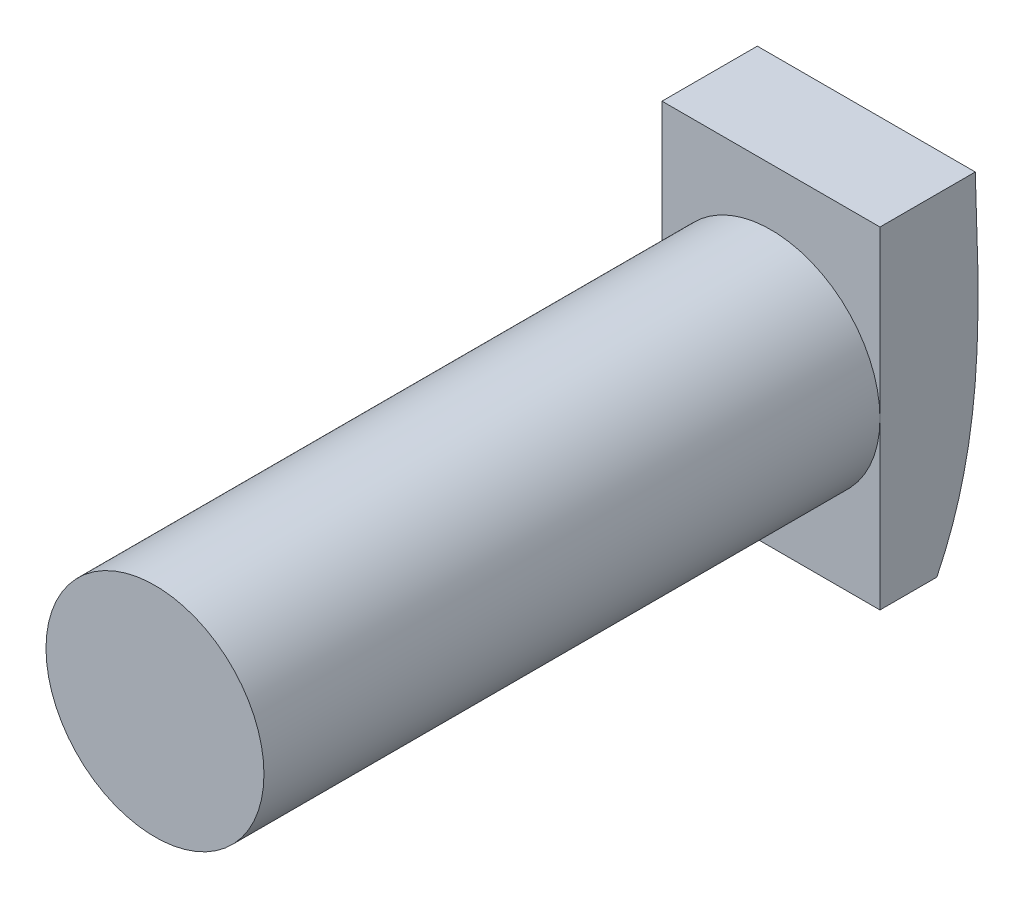
ISO-10303-21;
HEADER;
FILE_DESCRIPTION(('STEP AP214'),'2;1');
FILE_NAME('part.step','',(''),(''),'','','');
FILE_SCHEMA(('AUTOMOTIVE_DESIGN { 1 0 10303 214 1 1 1 1 }'));
ENDSEC;
DATA;
#1=APPLICATION_CONTEXT('core data for automotive mechanical design processes');
#2=APPLICATION_PROTOCOL_DEFINITION('international standard','automotive_design',2000,#1);
#3=PRODUCT_CONTEXT('',#1,'mechanical');
#4=PRODUCT('Part','Part','',(#3));
#5=PRODUCT_RELATED_PRODUCT_CATEGORY('part','',(#4));
#6=PRODUCT_DEFINITION_FORMATION('','',#4);
#7=PRODUCT_DEFINITION_CONTEXT('part definition',#1,'design');
#8=PRODUCT_DEFINITION('design','',#6,#7);
#9=PRODUCT_DEFINITION_SHAPE('','',#8);
#10=(LENGTH_UNIT() NAMED_UNIT(*) SI_UNIT(.MILLI.,.METRE.));
#11=(NAMED_UNIT(*) PLANE_ANGLE_UNIT() SI_UNIT($,.RADIAN.));
#12=(NAMED_UNIT(*) SI_UNIT($,.STERADIAN.) SOLID_ANGLE_UNIT());
#13=UNCERTAINTY_MEASURE_WITH_UNIT(LENGTH_MEASURE(1.E-05),#10,'distance_accuracy_value','');
#14=(GEOMETRIC_REPRESENTATION_CONTEXT(3) GLOBAL_UNCERTAINTY_ASSIGNED_CONTEXT((#13)) GLOBAL_UNIT_ASSIGNED_CONTEXT((#10,
#11,#12)) REPRESENTATION_CONTEXT('',''));
#15=CARTESIAN_POINT('',(0.,0.,0.));
#16=DIRECTION('',(0.,0.,1.));
#17=DIRECTION('',(1.,0.,0.));
#18=AXIS2_PLACEMENT_3D('',#15,#16,#17);
#19=CARTESIAN_POINT('',(0.,0.,13.));
#20=DIRECTION('',(0.,0.,-1.));
#21=DIRECTION('',(-1.,0.,0.));
#22=AXIS2_PLACEMENT_3D('',#19,#20,#21);
#23=CYLINDRICAL_SURFACE('',#22,2.3);
#24=CARTESIAN_POINT('',(0.,0.,13.));
#25=DIRECTION('',(0.,0.,1.));
#26=DIRECTION('',(1.,0.,0.));
#27=AXIS2_PLACEMENT_3D('',#24,#25,#26);
#28=CIRCLE('',#27,2.3);
#29=CARTESIAN_POINT('',(2.3,0.,13.));
#30=VERTEX_POINT('',#29);
#31=EDGE_CURVE('E11',#30,#30,#28,.T.);
#32=ORIENTED_EDGE('',*,*,#31,.F.);
#33=EDGE_LOOP('',(#32));
#34=FACE_BOUND('',#33,.T.);
#35=CARTESIAN_POINT('',(0.,0.,0.));
#36=DIRECTION('',(0.,0.,1.));
#37=DIRECTION('',(1.,0.,0.));
#38=AXIS2_PLACEMENT_3D('',#35,#36,#37);
#39=CIRCLE('',#38,2.3);
#40=CARTESIAN_POINT('',(2.3,0.,0.));
#41=VERTEX_POINT('',#40);
#42=CARTESIAN_POINT('',(-2.3,0.,0.));
#43=VERTEX_POINT('',#42);
#44=EDGE_CURVE('E35',#41,#43,#39,.T.);
#45=ORIENTED_EDGE('',*,*,#44,.T.);
#46=EDGE_CURVE('E107',#43,#41,#39,.T.);
#47=ORIENTED_EDGE('',*,*,#46,.T.);
#48=EDGE_LOOP('',(#45,#47));
#49=FACE_BOUND('',#48,.T.);
#50=ADVANCED_FACE('F32',(#34,#49),#23,.T.);
#51=CARTESIAN_POINT('',(0.,0.,13.));
#52=DIRECTION('',(0.,0.,1.));
#53=DIRECTION('',(1.,0.,0.));
#54=AXIS2_PLACEMENT_3D('',#51,#52,#53);
#55=PLANE('',#54);
#56=ORIENTED_EDGE('',*,*,#31,.T.);
#57=EDGE_LOOP('',(#56));
#58=FACE_BOUND('',#57,.T.);
#59=ADVANCED_FACE('F136',(#58),#55,.T.);
#60=CARTESIAN_POINT('',(0.,0.,0.));
#61=DIRECTION('',(0.,0.,1.));
#62=DIRECTION('',(1.,0.,0.));
#63=AXIS2_PLACEMENT_3D('',#60,#61,#62);
#64=PLANE('',#63);
#65=ORIENTED_EDGE('',*,*,#44,.F.);
#66=DIRECTION('',(0.,-1.,0.));
#67=VECTOR('',#66,1.);
#68=CARTESIAN_POINT('',(2.3,-3.5,0.));
#69=LINE('',#68,#67);
#70=CARTESIAN_POINT('',(2.3,3.5,0.));
#71=VERTEX_POINT('',#70);
#72=EDGE_CURVE('E54',#71,#41,#69,.T.);
#73=ORIENTED_EDGE('',*,*,#72,.F.);
#74=DIRECTION('',(1.,0.,0.));
#75=VECTOR('',#74,1.);
#76=CARTESIAN_POINT('',(2.3,3.5,0.));
#77=LINE('',#76,#75);
#78=CARTESIAN_POINT('',(-2.3,3.5,0.));
#79=VERTEX_POINT('',#78);
#80=EDGE_CURVE('E119',#79,#71,#77,.T.);
#81=ORIENTED_EDGE('',*,*,#80,.F.);
#82=DIRECTION('',(0.,1.,0.));
#83=VECTOR('',#82,1.);
#84=CARTESIAN_POINT('',(-2.3,-3.5,0.));
#85=LINE('',#84,#83);
#86=EDGE_CURVE('E118',#43,#79,#85,.T.);
#87=ORIENTED_EDGE('',*,*,#86,.F.);
#88=EDGE_LOOP('',(#65,#73,#81,#87));
#89=FACE_BOUND('',#88,.T.);
#90=ADVANCED_FACE('F116',(#89),#64,.T.);
#91=ORIENTED_EDGE('',*,*,#46,.F.);
#92=CARTESIAN_POINT('',(-2.3,-3.5,0.));
#93=VERTEX_POINT('',#92);
#94=EDGE_CURVE('E120',#93,#43,#85,.T.);
#95=ORIENTED_EDGE('',*,*,#94,.F.);
#96=DIRECTION('',(-1.,0.,0.));
#97=VECTOR('',#96,1.);
#98=CARTESIAN_POINT('',(2.3,-3.5,0.));
#99=LINE('',#98,#97);
#100=CARTESIAN_POINT('',(2.3,-3.5,0.));
#101=VERTEX_POINT('',#100);
#102=EDGE_CURVE('E97',#101,#93,#99,.T.);
#103=ORIENTED_EDGE('',*,*,#102,.F.);
#104=EDGE_CURVE('E123',#41,#101,#69,.T.);
#105=ORIENTED_EDGE('',*,*,#104,.F.);
#106=EDGE_LOOP('',(#91,#95,#103,#105));
#107=FACE_BOUND('',#106,.T.);
#108=ADVANCED_FACE('F127',(#107),#64,.T.);
#109=CARTESIAN_POINT('',(-2.3,-3.5,-3.));
#110=DIRECTION('',(1.,0.,0.));
#111=DIRECTION('',(0.,0.,-1.));
#112=AXIS2_PLACEMENT_3D('',#109,#110,#111);
#113=PLANE('',#112);
#114=DIRECTION('',(0.,0.,1.));
#115=VECTOR('',#114,1.);
#116=CARTESIAN_POINT('',(-2.3,3.5,-3.));
#117=LINE('',#116,#115);
#118=CARTESIAN_POINT('',(-2.3,3.5,-2.0115343006637));
#119=VERTEX_POINT('',#118);
#120=EDGE_CURVE('E93',#119,#79,#117,.T.);
#121=ORIENTED_EDGE('',*,*,#120,.F.);
#122=CARTESIAN_POINT('',(-2.3,3.5,-2.0115343006637));
#123=CARTESIAN_POINT('',(-2.3,1.18238891321301,-2.08240033991388));
#124=CARTESIAN_POINT('',(-2.3,-1.3344008735301,-2.26751473553337));
#125=CARTESIAN_POINT('',(-2.3,-3.5,-1.2));
#126=B_SPLINE_CURVE_WITH_KNOTS('',3,(#122,#123,#124,#125),.UNSPECIFIED.,.F.,.F.,(4,4),(0.,1.),.UNSPECIFIED.);
#127=CARTESIAN_POINT('',(-2.3,-3.5,-1.2));
#128=VERTEX_POINT('',#127);
#129=EDGE_CURVE('E79',#119,#128,#126,.T.);
#130=ORIENTED_EDGE('',*,*,#129,.T.);
#131=DIRECTION('',(0.,0.,1.));
#132=VECTOR('',#131,1.);
#133=CARTESIAN_POINT('',(-2.3,-3.5,-3.));
#134=LINE('',#133,#132);
#135=EDGE_CURVE('E90',#128,#93,#134,.T.);
#136=ORIENTED_EDGE('',*,*,#135,.T.);
#137=ORIENTED_EDGE('',*,*,#94,.T.);
#138=ORIENTED_EDGE('',*,*,#86,.T.);
#139=EDGE_LOOP('',(#121,#130,#136,#137,#138));
#140=FACE_BOUND('',#139,.T.);
#141=ADVANCED_FACE('F88',(#140),#113,.F.);
#142=CARTESIAN_POINT('',(2.3,3.5,-3.));
#143=DIRECTION('',(0.,-1.,0.));
#144=DIRECTION('',(0.,0.,-1.));
#145=AXIS2_PLACEMENT_3D('',#142,#143,#144);
#146=PLANE('',#145);
#147=DIRECTION('',(0.,0.,1.));
#148=VECTOR('',#147,1.);
#149=CARTESIAN_POINT('',(2.3,3.5,-3.));
#150=LINE('',#149,#148);
#151=CARTESIAN_POINT('',(2.3,3.5,-2.0115343006637));
#152=VERTEX_POINT('',#151);
#153=EDGE_CURVE('E101',#152,#71,#150,.T.);
#154=ORIENTED_EDGE('',*,*,#153,.F.);
#155=DIRECTION('',(1.,0.,0.));
#156=VECTOR('',#155,1.);
#157=CARTESIAN_POINT('',(-2.3,3.5,-2.0115343006637));
#158=LINE('',#157,#156);
#159=EDGE_CURVE('E84',#119,#152,#158,.T.);
#160=ORIENTED_EDGE('',*,*,#159,.F.);
#161=ORIENTED_EDGE('',*,*,#120,.T.);
#162=ORIENTED_EDGE('',*,*,#80,.T.);
#163=EDGE_LOOP('',(#154,#160,#161,#162));
#164=FACE_BOUND('',#163,.T.);
#165=ADVANCED_FACE('F134',(#164),#146,.F.);
#166=CARTESIAN_POINT('',(2.3,-3.5,-3.));
#167=DIRECTION('',(-1.,0.,0.));
#168=DIRECTION('',(0.,0.,1.));
#169=AXIS2_PLACEMENT_3D('',#166,#167,#168);
#170=PLANE('',#169);
#171=DIRECTION('',(0.,0.,1.));
#172=VECTOR('',#171,1.);
#173=CARTESIAN_POINT('',(2.3,-3.5,-3.));
#174=LINE('',#173,#172);
#175=CARTESIAN_POINT('',(2.3,-3.5,-1.2));
#176=VERTEX_POINT('',#175);
#177=EDGE_CURVE('E99',#176,#101,#174,.T.);
#178=ORIENTED_EDGE('',*,*,#177,.F.);
#179=CARTESIAN_POINT('',(2.3,3.5,-2.0115343006637));
#180=CARTESIAN_POINT('',(2.3,1.18238891321301,-2.08240033991388));
#181=CARTESIAN_POINT('',(2.3,-1.3344008735301,-2.26751473553337));
#182=CARTESIAN_POINT('',(2.3,-3.5,-1.2));
#183=B_SPLINE_CURVE_WITH_KNOTS('',3,(#179,#180,#181,#182),.UNSPECIFIED.,.F.,.F.,(4,4),(0.,1.),.UNSPECIFIED.);
#184=EDGE_CURVE('E46',#152,#176,#183,.T.);
#185=ORIENTED_EDGE('',*,*,#184,.F.);
#186=ORIENTED_EDGE('',*,*,#153,.T.);
#187=ORIENTED_EDGE('',*,*,#72,.T.);
#188=ORIENTED_EDGE('',*,*,#104,.T.);
#189=EDGE_LOOP('',(#178,#185,#186,#187,#188));
#190=FACE_BOUND('',#189,.T.);
#191=ADVANCED_FACE('F126',(#190),#170,.F.);
#192=CARTESIAN_POINT('',(2.3,-3.5,-3.));
#193=DIRECTION('',(0.,1.,0.));
#194=DIRECTION('',(0.,0.,1.));
#195=AXIS2_PLACEMENT_3D('',#192,#193,#194);
#196=PLANE('',#195);
#197=ORIENTED_EDGE('',*,*,#135,.F.);
#198=DIRECTION('',(1.,0.,0.));
#199=VECTOR('',#198,1.);
#200=CARTESIAN_POINT('',(-2.3,-3.5,-1.2));
#201=LINE('',#200,#199);
#202=EDGE_CURVE('E76',#128,#176,#201,.T.);
#203=ORIENTED_EDGE('',*,*,#202,.T.);
#204=ORIENTED_EDGE('',*,*,#177,.T.);
#205=ORIENTED_EDGE('',*,*,#102,.T.);
#206=EDGE_LOOP('',(#197,#203,#204,#205));
#207=FACE_BOUND('',#206,.T.);
#208=ADVANCED_FACE('F95',(#207),#196,.F.);
#209=DIRECTION('',(1.,0.,0.));
#210=VECTOR('',#209,1.);
#211=SURFACE_OF_LINEAR_EXTRUSION('',#126,#210);
#212=ORIENTED_EDGE('',*,*,#184,.T.);
#213=ORIENTED_EDGE('',*,*,#202,.F.);
#214=ORIENTED_EDGE('',*,*,#129,.F.);
#215=ORIENTED_EDGE('',*,*,#159,.T.);
#216=EDGE_LOOP('',(#212,#213,#214,#215));
#217=FACE_BOUND('',#216,.T.);
#218=ADVANCED_FACE('F78',(#217),#211,.F.);
#219=CLOSED_SHELL('',(#50,#59,#90,#108,#141,#165,#191,#208,#218));
#220=MANIFOLD_SOLID_BREP('B2',#219);
#221=ADVANCED_BREP_SHAPE_REPRESENTATION('',(#18,#220),#14);
#222=SHAPE_DEFINITION_REPRESENTATION(#9,#221);
ENDSEC;
END-ISO-10303-21;
